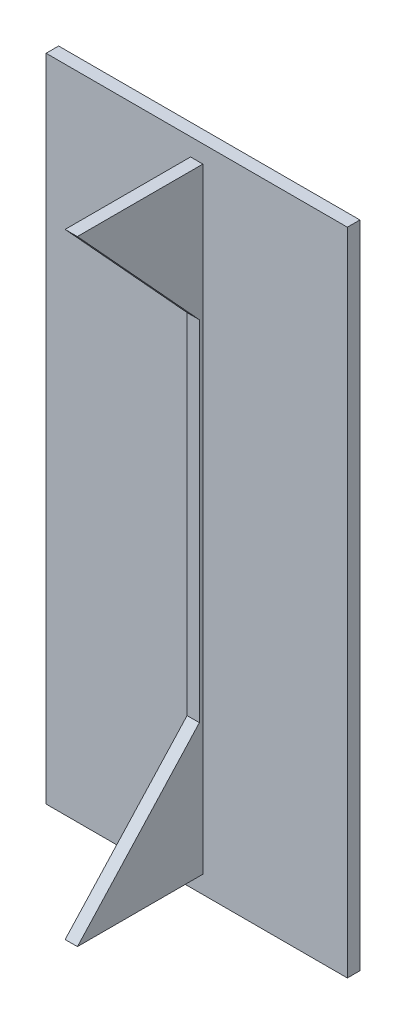
ISO-10303-21;
HEADER;
FILE_DESCRIPTION(('STEP AP214'),'2;1');
FILE_NAME('part.step','',(''),(''),'','','');
FILE_SCHEMA(('AUTOMOTIVE_DESIGN { 1 0 10303 214 1 1 1 1 }'));
ENDSEC;
DATA;
#1=APPLICATION_CONTEXT('core data for automotive mechanical design processes');
#2=APPLICATION_PROTOCOL_DEFINITION('international standard','automotive_design',2000,#1);
#3=PRODUCT_CONTEXT('',#1,'mechanical');
#4=PRODUCT('Part','Part','',(#3));
#5=PRODUCT_RELATED_PRODUCT_CATEGORY('part','',(#4));
#6=PRODUCT_DEFINITION_FORMATION('','',#4);
#7=PRODUCT_DEFINITION_CONTEXT('part definition',#1,'design');
#8=PRODUCT_DEFINITION('design','',#6,#7);
#9=PRODUCT_DEFINITION_SHAPE('','',#8);
#10=(LENGTH_UNIT() NAMED_UNIT(*) SI_UNIT(.MILLI.,.METRE.));
#11=(NAMED_UNIT(*) PLANE_ANGLE_UNIT() SI_UNIT($,.RADIAN.));
#12=(NAMED_UNIT(*) SI_UNIT($,.STERADIAN.) SOLID_ANGLE_UNIT());
#13=UNCERTAINTY_MEASURE_WITH_UNIT(LENGTH_MEASURE(1.E-05),#10,'distance_accuracy_value','');
#14=(GEOMETRIC_REPRESENTATION_CONTEXT(3) GLOBAL_UNCERTAINTY_ASSIGNED_CONTEXT((#13)) GLOBAL_UNIT_ASSIGNED_CONTEXT((#10,
#11,#12)) REPRESENTATION_CONTEXT('',''));
#15=CARTESIAN_POINT('',(0.,0.,0.));
#16=DIRECTION('',(0.,0.,1.));
#17=DIRECTION('',(1.,0.,0.));
#18=AXIS2_PLACEMENT_3D('',#15,#16,#17);
#19=CARTESIAN_POINT('',(0.,0.,1.28));
#20=DIRECTION('',(0.,0.,1.));
#21=DIRECTION('',(1.,0.,0.));
#22=AXIS2_PLACEMENT_3D('',#19,#20,#21);
#23=PLANE('',#22);
#24=DIRECTION('',(1.,0.,0.));
#25=VECTOR('',#24,1.);
#26=CARTESIAN_POINT('',(0.,-13.9,1.28));
#27=LINE('',#26,#25);
#28=CARTESIAN_POINT('',(-0.489999999999999,-13.9,1.28));
#29=VERTEX_POINT('',#28);
#30=CARTESIAN_POINT('',(0.490102229295915,-13.9,1.28));
#31=VERTEX_POINT('',#30);
#32=EDGE_CURVE('E133',#29,#31,#27,.T.);
#33=ORIENTED_EDGE('',*,*,#32,.T.);
#34=DIRECTION('',(0.,1.,0.));
#35=VECTOR('',#34,1.);
#36=CARTESIAN_POINT('',(0.490102229295915,-25.9,1.28));
#37=LINE('',#36,#35);
#38=CARTESIAN_POINT('',(0.490102229295915,13.9,1.28));
#39=VERTEX_POINT('',#38);
#40=EDGE_CURVE('E167',#31,#39,#37,.T.);
#41=ORIENTED_EDGE('',*,*,#40,.T.);
#42=DIRECTION('',(-1.,0.,0.));
#43=VECTOR('',#42,1.);
#44=CARTESIAN_POINT('',(0.,13.9,1.28));
#45=LINE('',#44,#43);
#46=CARTESIAN_POINT('',(-0.489999999999999,13.9,1.28));
#47=VERTEX_POINT('',#46);
#48=EDGE_CURVE('E129',#39,#47,#45,.T.);
#49=ORIENTED_EDGE('',*,*,#48,.T.);
#50=DIRECTION('',(0.,-1.,0.));
#51=VECTOR('',#50,1.);
#52=CARTESIAN_POINT('',(-0.489999999999999,25.9,1.28));
#53=LINE('',#52,#51);
#54=EDGE_CURVE('E131',#47,#29,#53,.T.);
#55=ORIENTED_EDGE('',*,*,#54,.T.);
#56=EDGE_LOOP('',(#33,#41,#49,#55));
#57=FACE_BOUND('',#56,.T.);
#58=ADVANCED_FACE('F35',(#57),#23,.T.);
#59=CARTESIAN_POINT('',(0.,0.,1.));
#60=DIRECTION('',(0.,0.,-1.));
#61=DIRECTION('',(-1.,0.,0.));
#62=AXIS2_PLACEMENT_3D('',#59,#60,#61);
#63=PLANE('',#62);
#64=DIRECTION('',(1.,0.,0.));
#65=VECTOR('',#64,1.);
#66=CARTESIAN_POINT('',(-12.,-25.9,1.));
#67=LINE('',#66,#65);
#68=CARTESIAN_POINT('',(-12.,-25.9,1.));
#69=VERTEX_POINT('',#68);
#70=CARTESIAN_POINT('',(12.,-25.9,1.));
#71=VERTEX_POINT('',#70);
#72=EDGE_CURVE('E158',#69,#71,#67,.T.);
#73=ORIENTED_EDGE('',*,*,#72,.T.);
#74=DIRECTION('',(0.,1.,0.));
#75=VECTOR('',#74,1.);
#76=CARTESIAN_POINT('',(12.,-25.9,1.));
#77=LINE('',#76,#75);
#78=CARTESIAN_POINT('',(12.,25.9,1.));
#79=VERTEX_POINT('',#78);
#80=EDGE_CURVE('E144',#71,#79,#77,.T.);
#81=ORIENTED_EDGE('',*,*,#80,.T.);
#82=DIRECTION('',(-1.,0.,0.));
#83=VECTOR('',#82,1.);
#84=CARTESIAN_POINT('',(-12.,25.9,1.));
#85=LINE('',#84,#83);
#86=CARTESIAN_POINT('',(-12.,25.9,1.));
#87=VERTEX_POINT('',#86);
#88=EDGE_CURVE('E147',#79,#87,#85,.T.);
#89=ORIENTED_EDGE('',*,*,#88,.T.);
#90=DIRECTION('',(0.,-1.,0.));
#91=VECTOR('',#90,1.);
#92=CARTESIAN_POINT('',(-12.,-25.9,1.));
#93=LINE('',#92,#91);
#94=EDGE_CURVE('E151',#87,#69,#93,.T.);
#95=ORIENTED_EDGE('',*,*,#94,.T.);
#96=EDGE_LOOP('',(#73,#81,#89,#95));
#97=FACE_BOUND('',#96,.T.);
#98=DIRECTION('',(0.,1.,0.));
#99=VECTOR('',#98,1.);
#100=CARTESIAN_POINT('',(0.490102229295915,-25.9,1.));
#101=LINE('',#100,#99);
#102=CARTESIAN_POINT('',(0.490102229295915,-24.4953959179242,1.));
#103=VERTEX_POINT('',#102);
#104=CARTESIAN_POINT('',(0.490102229295915,24.5,1.));
#105=VERTEX_POINT('',#104);
#106=EDGE_CURVE('E39',#103,#105,#101,.T.);
#107=ORIENTED_EDGE('',*,*,#106,.F.);
#108=DIRECTION('',(-1.,0.,0.));
#109=VECTOR('',#108,1.);
#110=CARTESIAN_POINT('',(10.51,-24.4953959179242,1.));
#111=LINE('',#110,#109);
#112=CARTESIAN_POINT('',(-0.489999999999999,-24.4953959179242,1.));
#113=VERTEX_POINT('',#112);
#114=EDGE_CURVE('E113',#103,#113,#111,.T.);
#115=ORIENTED_EDGE('',*,*,#114,.T.);
#116=DIRECTION('',(0.,-1.,0.));
#117=VECTOR('',#116,1.);
#118=CARTESIAN_POINT('',(-0.489999999999999,25.9,1.));
#119=LINE('',#118,#117);
#120=CARTESIAN_POINT('',(-0.489999999999999,24.5,1.));
#121=VERTEX_POINT('',#120);
#122=EDGE_CURVE('E118',#121,#113,#119,.T.);
#123=ORIENTED_EDGE('',*,*,#122,.F.);
#124=DIRECTION('',(-1.,0.,0.));
#125=VECTOR('',#124,1.);
#126=CARTESIAN_POINT('',(10.51,24.5,1.));
#127=LINE('',#126,#125);
#128=EDGE_CURVE('E217',#105,#121,#127,.T.);
#129=ORIENTED_EDGE('',*,*,#128,.F.);
#130=EDGE_LOOP('',(#107,#115,#123,#129));
#131=FACE_BOUND('',#130,.T.);
#132=ADVANCED_FACE('F115',(#97,#131),#63,.F.);
#133=CARTESIAN_POINT('',(12.,-25.9,1.));
#134=DIRECTION('',(-1.,0.,0.));
#135=DIRECTION('',(0.,0.,1.));
#136=AXIS2_PLACEMENT_3D('',#133,#134,#135);
#137=PLANE('',#136);
#138=DIRECTION('',(0.,1.,0.));
#139=VECTOR('',#138,1.);
#140=CARTESIAN_POINT('',(12.,-25.9,0.));
#141=LINE('',#140,#139);
#142=CARTESIAN_POINT('',(12.,-25.9,0.));
#143=VERTEX_POINT('',#142);
#144=CARTESIAN_POINT('',(12.,25.9,0.));
#145=VERTEX_POINT('',#144);
#146=EDGE_CURVE('E163',#143,#145,#141,.T.);
#147=ORIENTED_EDGE('',*,*,#146,.T.);
#148=DIRECTION('',(0.,0.,-1.));
#149=VECTOR('',#148,1.);
#150=CARTESIAN_POINT('',(12.,25.9,1.));
#151=LINE('',#150,#149);
#152=EDGE_CURVE('E156',#79,#145,#151,.T.);
#153=ORIENTED_EDGE('',*,*,#152,.F.);
#154=ORIENTED_EDGE('',*,*,#80,.F.);
#155=DIRECTION('',(0.,0.,-1.));
#156=VECTOR('',#155,1.);
#157=CARTESIAN_POINT('',(12.,-25.9,1.));
#158=LINE('',#157,#156);
#159=EDGE_CURVE('E160',#71,#143,#158,.T.);
#160=ORIENTED_EDGE('',*,*,#159,.T.);
#161=EDGE_LOOP('',(#147,#153,#154,#160));
#162=FACE_BOUND('',#161,.T.);
#163=ADVANCED_FACE('F37',(#162),#137,.F.);
#164=CARTESIAN_POINT('',(-12.,25.9,1.));
#165=DIRECTION('',(0.,-1.,0.));
#166=DIRECTION('',(0.,0.,-1.));
#167=AXIS2_PLACEMENT_3D('',#164,#165,#166);
#168=PLANE('',#167);
#169=DIRECTION('',(0.,0.,-1.));
#170=VECTOR('',#169,1.);
#171=CARTESIAN_POINT('',(-12.,25.9,1.));
#172=LINE('',#171,#170);
#173=CARTESIAN_POINT('',(-12.,25.9,0.));
#174=VERTEX_POINT('',#173);
#175=EDGE_CURVE('E176',#87,#174,#172,.T.);
#176=ORIENTED_EDGE('',*,*,#175,.F.);
#177=ORIENTED_EDGE('',*,*,#88,.F.);
#178=ORIENTED_EDGE('',*,*,#152,.T.);
#179=DIRECTION('',(-1.,0.,0.));
#180=VECTOR('',#179,1.);
#181=CARTESIAN_POINT('',(-12.,25.9,0.));
#182=LINE('',#181,#180);
#183=EDGE_CURVE('E166',#145,#174,#182,.T.);
#184=ORIENTED_EDGE('',*,*,#183,.T.);
#185=EDGE_LOOP('',(#176,#177,#178,#184));
#186=FACE_BOUND('',#185,.T.);
#187=ADVANCED_FACE('F255',(#186),#168,.F.);
#188=CARTESIAN_POINT('',(-12.,-25.9,1.));
#189=DIRECTION('',(1.,0.,0.));
#190=DIRECTION('',(0.,0.,-1.));
#191=AXIS2_PLACEMENT_3D('',#188,#189,#190);
#192=PLANE('',#191);
#193=DIRECTION('',(0.,-1.,0.));
#194=VECTOR('',#193,1.);
#195=CARTESIAN_POINT('',(-12.,-25.9,0.));
#196=LINE('',#195,#194);
#197=CARTESIAN_POINT('',(-12.,-25.9,0.));
#198=VERTEX_POINT('',#197);
#199=EDGE_CURVE('E169',#174,#198,#196,.T.);
#200=ORIENTED_EDGE('',*,*,#199,.T.);
#201=DIRECTION('',(0.,0.,-1.));
#202=VECTOR('',#201,1.);
#203=CARTESIAN_POINT('',(-12.,-25.9,1.));
#204=LINE('',#203,#202);
#205=EDGE_CURVE('E174',#69,#198,#204,.T.);
#206=ORIENTED_EDGE('',*,*,#205,.F.);
#207=ORIENTED_EDGE('',*,*,#94,.F.);
#208=ORIENTED_EDGE('',*,*,#175,.T.);
#209=EDGE_LOOP('',(#200,#206,#207,#208));
#210=FACE_BOUND('',#209,.T.);
#211=ADVANCED_FACE('F252',(#210),#192,.F.);
#212=CARTESIAN_POINT('',(-12.,-25.9,1.));
#213=DIRECTION('',(0.,1.,0.));
#214=DIRECTION('',(0.,0.,1.));
#215=AXIS2_PLACEMENT_3D('',#212,#213,#214);
#216=PLANE('',#215);
#217=ORIENTED_EDGE('',*,*,#159,.F.);
#218=ORIENTED_EDGE('',*,*,#72,.F.);
#219=ORIENTED_EDGE('',*,*,#205,.T.);
#220=DIRECTION('',(1.,0.,0.));
#221=VECTOR('',#220,1.);
#222=CARTESIAN_POINT('',(-12.,-25.9,0.));
#223=LINE('',#222,#221);
#224=EDGE_CURVE('E148',#198,#143,#223,.T.);
#225=ORIENTED_EDGE('',*,*,#224,.T.);
#226=EDGE_LOOP('',(#217,#218,#219,#225));
#227=FACE_BOUND('',#226,.T.);
#228=ADVANCED_FACE('F248',(#227),#216,.F.);
#229=CARTESIAN_POINT('',(0.,0.,0.));
#230=DIRECTION('',(0.,0.,-1.));
#231=DIRECTION('',(-1.,0.,0.));
#232=AXIS2_PLACEMENT_3D('',#229,#230,#231);
#233=PLANE('',#232);
#234=ORIENTED_EDGE('',*,*,#146,.F.);
#235=ORIENTED_EDGE('',*,*,#224,.F.);
#236=ORIENTED_EDGE('',*,*,#199,.F.);
#237=ORIENTED_EDGE('',*,*,#183,.F.);
#238=EDGE_LOOP('',(#234,#235,#236,#237));
#239=FACE_BOUND('',#238,.T.);
#240=ADVANCED_FACE('F244',(#239),#233,.T.);
#241=CARTESIAN_POINT('',(-0.489999999999999,25.9,1.28));
#242=DIRECTION('',(1.,0.,0.));
#243=DIRECTION('',(0.,0.,-1.));
#244=AXIS2_PLACEMENT_3D('',#241,#242,#243);
#245=PLANE('',#244);
#246=ORIENTED_EDGE('',*,*,#122,.T.);
#247=DIRECTION('',(0.,0.,-1.));
#248=VECTOR('',#247,1.);
#249=CARTESIAN_POINT('',(-0.489999999999999,-24.4953959179242,1.));
#250=LINE('',#249,#248);
#251=CARTESIAN_POINT('',(-0.489999999999999,-24.4953959179242,10.9924462580971));
#252=VERTEX_POINT('',#251);
#253=EDGE_CURVE('E119',#252,#113,#250,.T.);
#254=ORIENTED_EDGE('',*,*,#253,.F.);
#255=DIRECTION('',(0.,-0.737154140200742,0.675724628517346));
#256=VECTOR('',#255,1.);
#257=CARTESIAN_POINT('',(-0.489999999999999,-25.9,12.28));
#258=LINE('',#257,#256);
#259=EDGE_CURVE('E216',#29,#252,#258,.T.);
#260=ORIENTED_EDGE('',*,*,#259,.F.);
#261=ORIENTED_EDGE('',*,*,#54,.F.);
#262=DIRECTION('',(0.,0.737154140200741,0.675724628517347));
#263=VECTOR('',#262,1.);
#264=CARTESIAN_POINT('',(-0.489999999999999,20.4207547169811,7.25735849056604));
#265=LINE('',#264,#263);
#266=CARTESIAN_POINT('',(-0.489999999999999,24.5,10.9966666666667));
#267=VERTEX_POINT('',#266);
#268=EDGE_CURVE('E188',#47,#267,#265,.T.);
#269=ORIENTED_EDGE('',*,*,#268,.T.);
#270=DIRECTION('',(0.,0.,1.));
#271=VECTOR('',#270,1.);
#272=CARTESIAN_POINT('',(-0.489999999999999,24.5,1.));
#273=LINE('',#272,#271);
#274=EDGE_CURVE('E59',#121,#267,#273,.T.);
#275=ORIENTED_EDGE('',*,*,#274,.F.);
#276=EDGE_LOOP('',(#246,#254,#260,#261,#269,#275));
#277=FACE_BOUND('',#276,.T.);
#278=ADVANCED_FACE('F127',(#277),#245,.F.);
#279=CARTESIAN_POINT('',(0.490102229295915,-25.9,1.28));
#280=DIRECTION('',(-1.,0.,0.));
#281=DIRECTION('',(0.,0.,1.));
#282=AXIS2_PLACEMENT_3D('',#279,#280,#281);
#283=PLANE('',#282);
#284=DIRECTION('',(0.,-0.737154140200742,0.675724628517346));
#285=VECTOR('',#284,1.);
#286=CARTESIAN_POINT('',(0.490102229295915,-20.4207547169811,7.25735849056604));
#287=LINE('',#286,#285);
#288=CARTESIAN_POINT('',(0.490102229295915,-24.4953959179242,10.9924462580971));
#289=VERTEX_POINT('',#288);
#290=EDGE_CURVE('E198',#31,#289,#287,.T.);
#291=ORIENTED_EDGE('',*,*,#290,.T.);
#292=DIRECTION('',(0.,0.,-1.));
#293=VECTOR('',#292,1.);
#294=CARTESIAN_POINT('',(0.490102229295915,-24.4953959179242,1.28));
#295=LINE('',#294,#293);
#296=EDGE_CURVE('E52',#289,#103,#295,.T.);
#297=ORIENTED_EDGE('',*,*,#296,.T.);
#298=ORIENTED_EDGE('',*,*,#106,.T.);
#299=DIRECTION('',(0.,0.,1.));
#300=VECTOR('',#299,1.);
#301=CARTESIAN_POINT('',(0.490102229295915,24.5,1.28));
#302=LINE('',#301,#300);
#303=CARTESIAN_POINT('',(0.490102229295915,24.5,10.9966666666667));
#304=VERTEX_POINT('',#303);
#305=EDGE_CURVE('E215',#105,#304,#302,.T.);
#306=ORIENTED_EDGE('',*,*,#305,.T.);
#307=DIRECTION('',(0.,0.737154140200741,0.675724628517347));
#308=VECTOR('',#307,1.);
#309=CARTESIAN_POINT('',(0.490102229295915,13.9,1.28));
#310=LINE('',#309,#308);
#311=EDGE_CURVE('E190',#39,#304,#310,.T.);
#312=ORIENTED_EDGE('',*,*,#311,.F.);
#313=ORIENTED_EDGE('',*,*,#40,.F.);
#314=EDGE_LOOP('',(#291,#297,#298,#306,#312,#313));
#315=FACE_BOUND('',#314,.T.);
#316=ADVANCED_FACE('F214',(#315),#283,.F.);
#317=CARTESIAN_POINT('',(-10.5098977707041,13.9,1.28));
#318=DIRECTION('',(0.,0.675724628517347,-0.737154140200741));
#319=DIRECTION('',(0.,0.737154140200741,0.675724628517347));
#320=AXIS2_PLACEMENT_3D('',#317,#318,#319);
#321=PLANE('',#320);
#322=ORIENTED_EDGE('',*,*,#311,.T.);
#323=DIRECTION('',(-1.,0.,0.));
#324=VECTOR('',#323,1.);
#325=CARTESIAN_POINT('',(-10.5098977707041,24.5,10.9966666666667));
#326=LINE('',#325,#324);
#327=EDGE_CURVE('E45',#304,#267,#326,.T.);
#328=ORIENTED_EDGE('',*,*,#327,.T.);
#329=ORIENTED_EDGE('',*,*,#268,.F.);
#330=ORIENTED_EDGE('',*,*,#48,.F.);
#331=EDGE_LOOP('',(#322,#328,#329,#330));
#332=FACE_BOUND('',#331,.T.);
#333=ADVANCED_FACE('F187',(#332),#321,.F.);
#334=CARTESIAN_POINT('',(10.51,-25.9,12.28));
#335=DIRECTION('',(0.,-0.675724628517346,-0.737154140200742));
#336=DIRECTION('',(0.,0.737154140200742,-0.675724628517346));
#337=AXIS2_PLACEMENT_3D('',#334,#335,#336);
#338=PLANE('',#337);
#339=ORIENTED_EDGE('',*,*,#259,.T.);
#340=DIRECTION('',(1.,0.,0.));
#341=VECTOR('',#340,1.);
#342=CARTESIAN_POINT('',(10.51,-24.4953959179242,10.9924462580971));
#343=LINE('',#342,#341);
#344=EDGE_CURVE('E11',#252,#289,#343,.T.);
#345=ORIENTED_EDGE('',*,*,#344,.T.);
#346=ORIENTED_EDGE('',*,*,#290,.F.);
#347=ORIENTED_EDGE('',*,*,#32,.F.);
#348=EDGE_LOOP('',(#339,#345,#346,#347));
#349=FACE_BOUND('',#348,.T.);
#350=ADVANCED_FACE('F223',(#349),#338,.F.);
#351=CARTESIAN_POINT('',(10.51,24.5,1.));
#352=DIRECTION('',(0.,-1.,0.));
#353=DIRECTION('',(0.,0.,-1.));
#354=AXIS2_PLACEMENT_3D('',#351,#352,#353);
#355=PLANE('',#354);
#356=ORIENTED_EDGE('',*,*,#128,.T.);
#357=ORIENTED_EDGE('',*,*,#274,.T.);
#358=ORIENTED_EDGE('',*,*,#327,.F.);
#359=ORIENTED_EDGE('',*,*,#305,.F.);
#360=EDGE_LOOP('',(#356,#357,#358,#359));
#361=FACE_BOUND('',#360,.T.);
#362=ADVANCED_FACE('F225',(#361),#355,.F.);
#363=CARTESIAN_POINT('',(10.51,-24.4953959179242,1.));
#364=DIRECTION('',(0.,1.,0.));
#365=DIRECTION('',(0.,0.,1.));
#366=AXIS2_PLACEMENT_3D('',#363,#364,#365);
#367=PLANE('',#366);
#368=ORIENTED_EDGE('',*,*,#344,.F.);
#369=ORIENTED_EDGE('',*,*,#253,.T.);
#370=ORIENTED_EDGE('',*,*,#114,.F.);
#371=ORIENTED_EDGE('',*,*,#296,.F.);
#372=EDGE_LOOP('',(#368,#369,#370,#371));
#373=FACE_BOUND('',#372,.T.);
#374=ADVANCED_FACE('F122',(#373),#367,.F.);
#375=CLOSED_SHELL('',(#58,#132,#163,#187,#211,#228,#240,#278,#316,#333,#350,#362,#374));
#376=MANIFOLD_SOLID_BREP('B2',#375);
#377=ADVANCED_BREP_SHAPE_REPRESENTATION('',(#18,#376),#14);
#378=SHAPE_DEFINITION_REPRESENTATION(#9,#377);
ENDSEC;
END-ISO-10303-21;
